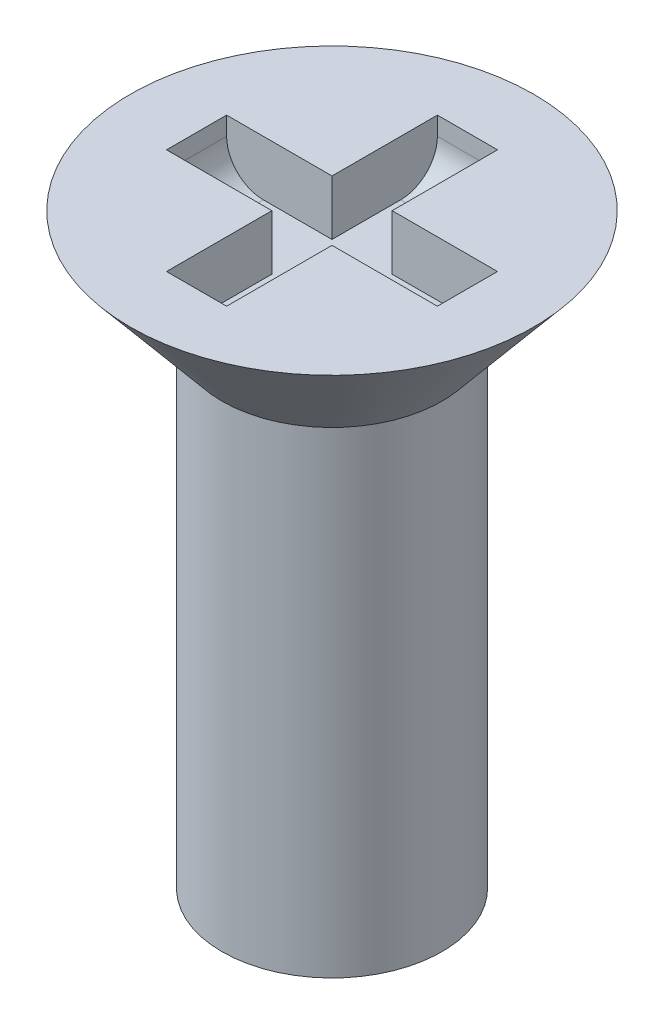
ISO-10303-21;
HEADER;
FILE_DESCRIPTION(('STEP AP214'),'2;1');
FILE_NAME('part.step','',(''),(''),'','','');
FILE_SCHEMA(('AUTOMOTIVE_DESIGN { 1 0 10303 214 1 1 1 1 }'));
ENDSEC;
DATA;
#1=APPLICATION_CONTEXT('core data for automotive mechanical design processes');
#2=APPLICATION_PROTOCOL_DEFINITION('international standard','automotive_design',2000,#1);
#3=PRODUCT_CONTEXT('',#1,'mechanical');
#4=PRODUCT('Part','Part','',(#3));
#5=PRODUCT_RELATED_PRODUCT_CATEGORY('part','',(#4));
#6=PRODUCT_DEFINITION_FORMATION('','',#4);
#7=PRODUCT_DEFINITION_CONTEXT('part definition',#1,'design');
#8=PRODUCT_DEFINITION('design','',#6,#7);
#9=PRODUCT_DEFINITION_SHAPE('','',#8);
#10=(LENGTH_UNIT() NAMED_UNIT(*) SI_UNIT(.MILLI.,.METRE.));
#11=(NAMED_UNIT(*) PLANE_ANGLE_UNIT() SI_UNIT($,.RADIAN.));
#12=(NAMED_UNIT(*) SI_UNIT($,.STERADIAN.) SOLID_ANGLE_UNIT());
#13=UNCERTAINTY_MEASURE_WITH_UNIT(LENGTH_MEASURE(1.E-05),#10,'distance_accuracy_value','');
#14=(GEOMETRIC_REPRESENTATION_CONTEXT(3) GLOBAL_UNCERTAINTY_ASSIGNED_CONTEXT((#13)) GLOBAL_UNIT_ASSIGNED_CONTEXT((#10,
#11,#12)) REPRESENTATION_CONTEXT('',''));
#15=CARTESIAN_POINT('',(0.,0.,0.));
#16=DIRECTION('',(0.,0.,1.));
#17=DIRECTION('',(1.,0.,0.));
#18=AXIS2_PLACEMENT_3D('',#15,#16,#17);
#19=CARTESIAN_POINT('',(-2.69311577807939,15.5,-0.81958016458445));
#20=DIRECTION('',(0.,0.,1.));
#21=DIRECTION('',(1.,0.,0.));
#22=AXIS2_PLACEMENT_3D('',#19,#20,#21);
#23=CYLINDRICAL_SURFACE('',#22,1.);
#24=DIRECTION('',(0.,0.,-1.));
#25=VECTOR('',#24,1.);
#26=CARTESIAN_POINT('',(-3.69311577807939,15.5,-0.819580164584451));
#27=LINE('',#26,#25);
#28=CARTESIAN_POINT('',(-3.69311577807939,15.5,0.819580164584451));
#29=VERTEX_POINT('',#28);
#30=CARTESIAN_POINT('',(-3.69311577807939,15.5,-0.819580164584451));
#31=VERTEX_POINT('',#30);
#32=EDGE_CURVE('E274',#29,#31,#27,.T.);
#33=ORIENTED_EDGE('',*,*,#32,.F.);
#34=CARTESIAN_POINT('',(-2.69311577807939,15.5,0.819580164584452));
#35=DIRECTION('',(0.,0.,1.));
#36=DIRECTION('',(1.,0.,0.));
#37=AXIS2_PLACEMENT_3D('',#34,#35,#36);
#38=CIRCLE('',#37,1.);
#39=CARTESIAN_POINT('',(-2.69311577807939,14.5,0.819580164584451));
#40=VERTEX_POINT('',#39);
#41=EDGE_CURVE('E40',#40,#29,#38,.F.);
#42=ORIENTED_EDGE('',*,*,#41,.F.);
#43=DIRECTION('',(0.,0.,-1.));
#44=VECTOR('',#43,1.);
#45=CARTESIAN_POINT('',(-2.69311577807939,14.5,-0.81958016458445));
#46=LINE('',#45,#44);
#47=CARTESIAN_POINT('',(-2.69311577807939,14.5,-0.819580164584451));
#48=VERTEX_POINT('',#47);
#49=EDGE_CURVE('E277',#48,#40,#46,.F.);
#50=ORIENTED_EDGE('',*,*,#49,.F.);
#51=CARTESIAN_POINT('',(-2.69311577807939,15.5,-0.819580164584451));
#52=DIRECTION('',(0.,0.,-1.));
#53=DIRECTION('',(-1.,0.,0.));
#54=AXIS2_PLACEMENT_3D('',#51,#52,#53);
#55=CIRCLE('',#54,1.);
#56=EDGE_CURVE('E11',#31,#48,#55,.F.);
#57=ORIENTED_EDGE('',*,*,#56,.F.);
#58=EDGE_LOOP('',(#33,#42,#50,#57));
#59=FACE_BOUND('',#58,.T.);
#60=ADVANCED_FACE('F33',(#59),#23,.F.);
#61=CARTESIAN_POINT('',(0.819580164584451,15.5,2.69311577807939));
#62=DIRECTION('',(1.,0.,0.));
#63=DIRECTION('',(0.,0.,-1.));
#64=AXIS2_PLACEMENT_3D('',#61,#62,#63);
#65=CYLINDRICAL_SURFACE('',#64,1.);
#66=DIRECTION('',(-1.,0.,0.));
#67=VECTOR('',#66,1.);
#68=CARTESIAN_POINT('',(0.819580164584451,15.5,3.69311577807939));
#69=LINE('',#68,#67);
#70=CARTESIAN_POINT('',(0.819580164584451,15.5,3.69311577807939));
#71=VERTEX_POINT('',#70);
#72=CARTESIAN_POINT('',(-0.819580164584451,15.5,3.69311577807939));
#73=VERTEX_POINT('',#72);
#74=EDGE_CURVE('E266',#71,#73,#69,.T.);
#75=ORIENTED_EDGE('',*,*,#74,.F.);
#76=CARTESIAN_POINT('',(0.819580164584451,15.5,2.69311577807939));
#77=DIRECTION('',(1.,0.,0.));
#78=DIRECTION('',(0.,0.,-1.));
#79=AXIS2_PLACEMENT_3D('',#76,#77,#78);
#80=CIRCLE('',#79,1.);
#81=CARTESIAN_POINT('',(0.819580164584451,14.5,2.69311577807939));
#82=VERTEX_POINT('',#81);
#83=EDGE_CURVE('E270',#82,#71,#80,.F.);
#84=ORIENTED_EDGE('',*,*,#83,.F.);
#85=DIRECTION('',(-1.,0.,0.));
#86=VECTOR('',#85,1.);
#87=CARTESIAN_POINT('',(0.819580164584451,14.5,2.69311577807939));
#88=LINE('',#87,#86);
#89=CARTESIAN_POINT('',(-0.819580164584451,14.5,2.69311577807939));
#90=VERTEX_POINT('',#89);
#91=EDGE_CURVE('E153',#90,#82,#88,.F.);
#92=ORIENTED_EDGE('',*,*,#91,.F.);
#93=CARTESIAN_POINT('',(-0.819580164584451,15.5,2.69311577807939));
#94=DIRECTION('',(-1.,0.,0.));
#95=DIRECTION('',(0.,0.,1.));
#96=AXIS2_PLACEMENT_3D('',#93,#94,#95);
#97=CIRCLE('',#96,1.);
#98=EDGE_CURVE('E272',#73,#90,#97,.F.);
#99=ORIENTED_EDGE('',*,*,#98,.F.);
#100=EDGE_LOOP('',(#75,#84,#92,#99));
#101=FACE_BOUND('',#100,.T.);
#102=ADVANCED_FACE('F338',(#101),#65,.F.);
#103=CARTESIAN_POINT('',(2.69311577807939,15.5,-0.819580164584451));
#104=DIRECTION('',(0.,0.,-1.));
#105=DIRECTION('',(-1.,0.,0.));
#106=AXIS2_PLACEMENT_3D('',#103,#104,#105);
#107=CYLINDRICAL_SURFACE('',#106,1.);
#108=DIRECTION('',(0.,0.,1.));
#109=VECTOR('',#108,1.);
#110=CARTESIAN_POINT('',(3.69311577807939,15.5,-0.819580164584452));
#111=LINE('',#110,#109);
#112=CARTESIAN_POINT('',(3.69311577807939,15.5,-0.819580164584452));
#113=VERTEX_POINT('',#112);
#114=CARTESIAN_POINT('',(3.69311577807939,15.5,0.81958016458445));
#115=VERTEX_POINT('',#114);
#116=EDGE_CURVE('E258',#113,#115,#111,.T.);
#117=ORIENTED_EDGE('',*,*,#116,.F.);
#118=CARTESIAN_POINT('',(2.69311577807939,15.5,-0.819580164584451));
#119=DIRECTION('',(0.,0.,-1.));
#120=DIRECTION('',(-1.,0.,0.));
#121=AXIS2_PLACEMENT_3D('',#118,#119,#120);
#122=CIRCLE('',#121,1.);
#123=CARTESIAN_POINT('',(2.69311577807939,14.5,-0.819580164584451));
#124=VERTEX_POINT('',#123);
#125=EDGE_CURVE('E263',#124,#113,#122,.F.);
#126=ORIENTED_EDGE('',*,*,#125,.F.);
#127=DIRECTION('',(0.,0.,1.));
#128=VECTOR('',#127,1.);
#129=CARTESIAN_POINT('',(2.69311577807939,14.5,-0.819580164584451));
#130=LINE('',#129,#128);
#131=CARTESIAN_POINT('',(2.69311577807939,14.5,0.819580164584451));
#132=VERTEX_POINT('',#131);
#133=EDGE_CURVE('E261',#132,#124,#130,.F.);
#134=ORIENTED_EDGE('',*,*,#133,.F.);
#135=CARTESIAN_POINT('',(2.69311577807939,15.5,0.81958016458445));
#136=DIRECTION('',(0.,0.,1.));
#137=DIRECTION('',(1.,0.,0.));
#138=AXIS2_PLACEMENT_3D('',#135,#136,#137);
#139=CIRCLE('',#138,1.);
#140=EDGE_CURVE('E170',#115,#132,#139,.F.);
#141=ORIENTED_EDGE('',*,*,#140,.F.);
#142=EDGE_LOOP('',(#117,#126,#134,#141));
#143=FACE_BOUND('',#142,.T.);
#144=ADVANCED_FACE('F324',(#143),#107,.F.);
#145=CARTESIAN_POINT('',(0.81958016458445,15.5,-2.69311577807939));
#146=DIRECTION('',(-1.,0.,0.));
#147=DIRECTION('',(0.,0.,1.));
#148=AXIS2_PLACEMENT_3D('',#145,#146,#147);
#149=CYLINDRICAL_SURFACE('',#148,1.);
#150=DIRECTION('',(1.,0.,0.));
#151=VECTOR('',#150,1.);
#152=CARTESIAN_POINT('',(0.81958016458445,15.5,-3.69311577807939));
#153=LINE('',#152,#151);
#154=CARTESIAN_POINT('',(-0.819580164584452,15.5,-3.69311577807939));
#155=VERTEX_POINT('',#154);
#156=CARTESIAN_POINT('',(0.81958016458445,15.5,-3.69311577807939));
#157=VERTEX_POINT('',#156);
#158=EDGE_CURVE('E246',#155,#157,#153,.T.);
#159=ORIENTED_EDGE('',*,*,#158,.F.);
#160=CARTESIAN_POINT('',(-0.819580164584451,15.5,-2.69311577807939));
#161=DIRECTION('',(-1.,0.,0.));
#162=DIRECTION('',(0.,0.,1.));
#163=AXIS2_PLACEMENT_3D('',#160,#161,#162);
#164=CIRCLE('',#163,1.);
#165=CARTESIAN_POINT('',(-0.819580164584451,14.5,-2.69311577807939));
#166=VERTEX_POINT('',#165);
#167=EDGE_CURVE('E254',#166,#155,#164,.F.);
#168=ORIENTED_EDGE('',*,*,#167,.F.);
#169=DIRECTION('',(1.,0.,0.));
#170=VECTOR('',#169,1.);
#171=CARTESIAN_POINT('',(0.81958016458445,14.5,-2.69311577807939));
#172=LINE('',#171,#170);
#173=CARTESIAN_POINT('',(0.819580164584451,14.5,-2.69311577807939));
#174=VERTEX_POINT('',#173);
#175=EDGE_CURVE('E251',#174,#166,#172,.F.);
#176=ORIENTED_EDGE('',*,*,#175,.F.);
#177=CARTESIAN_POINT('',(0.819580164584451,15.5,-2.69311577807939));
#178=DIRECTION('',(1.,0.,0.));
#179=DIRECTION('',(0.,0.,-1.));
#180=AXIS2_PLACEMENT_3D('',#177,#178,#179);
#181=CIRCLE('',#180,1.);
#182=EDGE_CURVE('E256',#157,#174,#181,.F.);
#183=ORIENTED_EDGE('',*,*,#182,.F.);
#184=EDGE_LOOP('',(#159,#168,#176,#183));
#185=FACE_BOUND('',#184,.T.);
#186=ADVANCED_FACE('F327',(#185),#149,.F.);
#187=CARTESIAN_POINT('',(0.,13.,0.));
#188=DIRECTION('',(0.,-1.,0.));
#189=DIRECTION('',(0.,0.,-1.));
#190=AXIS2_PLACEMENT_3D('',#187,#188,#189);
#191=CYLINDRICAL_SURFACE('',#190,3.);
#192=CARTESIAN_POINT('',(0.,13.,0.));
#193=DIRECTION('',(0.,1.,0.));
#194=DIRECTION('',(0.,0.,1.));
#195=AXIS2_PLACEMENT_3D('',#192,#193,#194);
#196=CIRCLE('',#195,3.);
#197=CARTESIAN_POINT('',(0.,13.,-3.));
#198=VERTEX_POINT('',#197);
#199=EDGE_CURVE('E243',#198,#198,#196,.T.);
#200=CARTESIAN_POINT('',(0.,0.,0.));
#201=DIRECTION('',(0.,1.,0.));
#202=DIRECTION('',(0.,0.,1.));
#203=AXIS2_PLACEMENT_3D('',#200,#201,#202);
#204=CIRCLE('',#203,3.);
#205=CARTESIAN_POINT('',(0.,0.,-3.));
#206=VERTEX_POINT('',#205);
#207=EDGE_CURVE('E242',#206,#206,#204,.T.);
#208=CARTESIAN_POINT('',(0.,13.,-3.));
#209=CARTESIAN_POINT('',(0.,12.8645833333333,-3.));
#210=CARTESIAN_POINT('',(0.,12.7291666666667,-3.));
#211=CARTESIAN_POINT('',(0.,12.4583333333333,-3.));
#212=CARTESIAN_POINT('',(0.,12.3229166666667,-3.));
#213=CARTESIAN_POINT('',(0.,12.0520833333333,-3.));
#214=CARTESIAN_POINT('',(0.,11.9166666666667,-3.));
#215=CARTESIAN_POINT('',(0.,11.6458333333333,-3.));
#216=CARTESIAN_POINT('',(0.,11.5104166666667,-3.));
#217=CARTESIAN_POINT('',(0.,11.2395833333333,-3.));
#218=CARTESIAN_POINT('',(0.,11.1041666666667,-3.));
#219=CARTESIAN_POINT('',(0.,10.8333333333333,-3.));
#220=CARTESIAN_POINT('',(0.,10.6979166666667,-3.));
#221=CARTESIAN_POINT('',(0.,10.4270833333333,-3.));
#222=CARTESIAN_POINT('',(0.,10.2916666666667,-3.));
#223=CARTESIAN_POINT('',(0.,10.0208333333333,-3.));
#224=CARTESIAN_POINT('',(0.,9.88541666666667,-3.));
#225=CARTESIAN_POINT('',(0.,9.61458333333333,-3.));
#226=CARTESIAN_POINT('',(0.,9.47916666666667,-3.));
#227=CARTESIAN_POINT('',(0.,9.20833333333333,-3.));
#228=CARTESIAN_POINT('',(0.,9.07291666666667,-3.));
#229=CARTESIAN_POINT('',(0.,8.80208333333333,-3.));
#230=CARTESIAN_POINT('',(0.,8.66666666666667,-3.));
#231=CARTESIAN_POINT('',(0.,8.39583333333333,-3.));
#232=CARTESIAN_POINT('',(0.,8.26041666666667,-3.));
#233=CARTESIAN_POINT('',(0.,7.98958333333333,-3.));
#234=CARTESIAN_POINT('',(0.,7.85416666666667,-3.));
#235=CARTESIAN_POINT('',(0.,7.58333333333333,-3.));
#236=CARTESIAN_POINT('',(0.,7.44791666666667,-3.));
#237=CARTESIAN_POINT('',(0.,7.17708333333333,-3.));
#238=CARTESIAN_POINT('',(0.,7.04166666666667,-3.));
#239=CARTESIAN_POINT('',(0.,6.77083333333333,-3.));
#240=CARTESIAN_POINT('',(0.,6.63541666666667,-3.));
#241=CARTESIAN_POINT('',(0.,6.36458333333333,-3.));
#242=CARTESIAN_POINT('',(0.,6.22916666666667,-3.));
#243=CARTESIAN_POINT('',(0.,5.95833333333333,-3.));
#244=CARTESIAN_POINT('',(0.,5.82291666666667,-3.));
#245=CARTESIAN_POINT('',(0.,5.55208333333333,-3.));
#246=CARTESIAN_POINT('',(0.,5.41666666666667,-3.));
#247=CARTESIAN_POINT('',(0.,5.14583333333333,-3.));
#248=CARTESIAN_POINT('',(0.,5.01041666666667,-3.));
#249=CARTESIAN_POINT('',(0.,4.73958333333333,-3.));
#250=CARTESIAN_POINT('',(0.,4.60416666666667,-3.));
#251=CARTESIAN_POINT('',(0.,4.33333333333333,-3.));
#252=CARTESIAN_POINT('',(0.,4.19791666666667,-3.));
#253=CARTESIAN_POINT('',(0.,3.92708333333333,-3.));
#254=CARTESIAN_POINT('',(0.,3.79166666666667,-3.));
#255=CARTESIAN_POINT('',(0.,3.52083333333333,-3.));
#256=CARTESIAN_POINT('',(0.,3.38541666666667,-3.));
#257=CARTESIAN_POINT('',(0.,3.11458333333333,-3.));
#258=CARTESIAN_POINT('',(0.,2.97916666666667,-3.));
#259=CARTESIAN_POINT('',(0.,2.70833333333333,-3.));
#260=CARTESIAN_POINT('',(0.,2.57291666666667,-3.));
#261=CARTESIAN_POINT('',(0.,2.30208333333333,-3.));
#262=CARTESIAN_POINT('',(0.,2.16666666666667,-3.));
#263=CARTESIAN_POINT('',(0.,1.89583333333333,-3.));
#264=CARTESIAN_POINT('',(0.,1.76041666666667,-3.));
#265=CARTESIAN_POINT('',(0.,1.48958333333333,-3.));
#266=CARTESIAN_POINT('',(0.,1.35416666666667,-3.));
#267=CARTESIAN_POINT('',(0.,1.08333333333333,-3.));
#268=CARTESIAN_POINT('',(0.,0.947916666666667,-3.));
#269=CARTESIAN_POINT('',(0.,0.677083333333334,-3.));
#270=CARTESIAN_POINT('',(0.,0.541666666666667,-3.));
#271=CARTESIAN_POINT('',(0.,0.270833333333334,-3.));
#272=CARTESIAN_POINT('',(0.,0.135416666666667,-3.));
#273=CARTESIAN_POINT('',(0.,0.,-3.));
#274=B_SPLINE_CURVE_WITH_KNOTS('',3,(#208,#209,#210,#211,#212,#213,#214,#215,#216,#217,#218,
#219,#220,#221,#222,#223,#224,#225,#226,#227,#228,#229,#230,#231,#232,#233,#234,#235,#236,#237,
#238,#239,#240,#241,#242,#243,#244,#245,#246,#247,#248,#249,#250,#251,#252,#253,#254,#255,#256,
#257,#258,#259,#260,#261,#262,#263,#264,#265,#266,#267,#268,#269,#270,#271,#272,#273),
.UNSPECIFIED.,.F.,.F.,(4,2,2,2,2,2,2,2,2,2,2,2,2,2,2,2,2,2,2,2,2,2,2,2,2,2,2,2,2,2,2,2,4),(0.,
0.406249999999999,0.812499999999999,1.21875,1.625,2.03125,2.4375,2.84375,3.25,3.65625,4.0625,
4.46875,4.875,5.28125,5.6875,6.09375,6.5,6.90625,7.3125,7.71875,8.125,8.53125,8.9375,9.34375,
9.75,10.15625,10.5625,10.96875,11.375,11.78125,12.1875,12.59375,13.),.UNSPECIFIED.);
#275=EDGE_CURVE('BSEAM329',#198,#206,#274,.T.);
#276=ORIENTED_EDGE('',*,*,#199,.F.);
#277=ORIENTED_EDGE('',*,*,#207,.T.);
#278=ORIENTED_EDGE('',*,*,#275,.T.);
#279=ORIENTED_EDGE('',*,*,#275,.F.);
#280=EDGE_LOOP('',(#276,#278,#277,#279));
#281=FACE_BOUND('',#280,.T.);
#282=ADVANCED_FACE('F329',(#281),#191,.T.);
#283=CARTESIAN_POINT('',(0.,0.,0.));
#284=DIRECTION('',(0.,1.,0.));
#285=DIRECTION('',(0.,0.,1.));
#286=AXIS2_PLACEMENT_3D('',#283,#284,#285);
#287=PLANE('',#286);
#288=ORIENTED_EDGE('',*,*,#207,.F.);
#289=EDGE_LOOP('',(#288));
#290=FACE_BOUND('',#289,.T.);
#291=ADVANCED_FACE('F335',(#290),#287,.F.);
#292=CARTESIAN_POINT('',(0.,16.,0.));
#293=DIRECTION('',(0.,1.,0.));
#294=DIRECTION('',(0.,0.,1.));
#295=AXIS2_PLACEMENT_3D('',#292,#293,#294);
#296=CONICAL_SURFACE('',#295,5.5,0.694738276196703);
#297=ORIENTED_EDGE('',*,*,#199,.T.);
#298=EDGE_LOOP('',(#297));
#299=FACE_BOUND('',#298,.T.);
#300=CARTESIAN_POINT('',(0.,16.,0.));
#301=DIRECTION('',(0.,-1.,0.));
#302=DIRECTION('',(0.,0.,-1.));
#303=AXIS2_PLACEMENT_3D('',#300,#301,#302);
#304=CIRCLE('',#303,5.5);
#305=CARTESIAN_POINT('',(0.,16.,-5.5));
#306=VERTEX_POINT('',#305);
#307=EDGE_CURVE('E222',#306,#306,#304,.T.);
#308=ORIENTED_EDGE('',*,*,#307,.T.);
#309=EDGE_LOOP('',(#308));
#310=FACE_BOUND('',#309,.T.);
#311=ADVANCED_FACE('F365',(#299,#310),#296,.T.);
#312=CARTESIAN_POINT('',(-5.5,16.,0.));
#313=DIRECTION('',(0.,-1.,0.));
#314=DIRECTION('',(0.,0.,-1.));
#315=AXIS2_PLACEMENT_3D('',#312,#313,#314);
#316=PLANE('',#315);
#317=DIRECTION('',(1.,0.,0.));
#318=VECTOR('',#317,1.);
#319=CARTESIAN_POINT('',(0.819580164584451,16.,3.69311577807939));
#320=LINE('',#319,#318);
#321=CARTESIAN_POINT('',(-0.819580164584451,16.,3.69311577807939));
#322=VERTEX_POINT('',#321);
#323=CARTESIAN_POINT('',(0.819580164584451,16.,3.69311577807939));
#324=VERTEX_POINT('',#323);
#325=EDGE_CURVE('E190',#322,#324,#320,.T.);
#326=ORIENTED_EDGE('',*,*,#325,.F.);
#327=DIRECTION('',(0.,0.,1.));
#328=VECTOR('',#327,1.);
#329=CARTESIAN_POINT('',(-0.819580164584451,16.,0.819580164584452));
#330=LINE('',#329,#328);
#331=CARTESIAN_POINT('',(-0.819580164584451,16.,0.819580164584452));
#332=VERTEX_POINT('',#331);
#333=EDGE_CURVE('E187',#332,#322,#330,.T.);
#334=ORIENTED_EDGE('',*,*,#333,.F.);
#335=DIRECTION('',(1.,0.,0.));
#336=VECTOR('',#335,1.);
#337=CARTESIAN_POINT('',(-0.819580164584451,16.,0.819580164584452));
#338=LINE('',#337,#336);
#339=CARTESIAN_POINT('',(-3.69311577807939,16.,0.819580164584451));
#340=VERTEX_POINT('',#339);
#341=EDGE_CURVE('E217',#340,#332,#338,.T.);
#342=ORIENTED_EDGE('',*,*,#341,.F.);
#343=DIRECTION('',(0.,0.,1.));
#344=VECTOR('',#343,1.);
#345=CARTESIAN_POINT('',(-3.69311577807939,16.,-0.819580164584451));
#346=LINE('',#345,#344);
#347=CARTESIAN_POINT('',(-3.69311577807939,16.,-0.819580164584451));
#348=VERTEX_POINT('',#347);
#349=EDGE_CURVE('E214',#348,#340,#346,.T.);
#350=ORIENTED_EDGE('',*,*,#349,.F.);
#351=DIRECTION('',(-1.,0.,0.));
#352=VECTOR('',#351,1.);
#353=CARTESIAN_POINT('',(-0.819580164584451,16.,-0.819580164584451));
#354=LINE('',#353,#352);
#355=CARTESIAN_POINT('',(-0.819580164584451,16.,-0.819580164584451));
#356=VERTEX_POINT('',#355);
#357=EDGE_CURVE('E211',#356,#348,#354,.T.);
#358=ORIENTED_EDGE('',*,*,#357,.F.);
#359=DIRECTION('',(0.,0.,1.));
#360=VECTOR('',#359,1.);
#361=CARTESIAN_POINT('',(-0.819580164584452,16.,-3.69311577807939));
#362=LINE('',#361,#360);
#363=CARTESIAN_POINT('',(-0.819580164584452,16.,-3.69311577807939));
#364=VERTEX_POINT('',#363);
#365=EDGE_CURVE('E208',#364,#356,#362,.T.);
#366=ORIENTED_EDGE('',*,*,#365,.F.);
#367=DIRECTION('',(-1.,0.,0.));
#368=VECTOR('',#367,1.);
#369=CARTESIAN_POINT('',(0.81958016458445,16.,-3.69311577807939));
#370=LINE('',#369,#368);
#371=CARTESIAN_POINT('',(0.81958016458445,16.,-3.69311577807939));
#372=VERTEX_POINT('',#371);
#373=EDGE_CURVE('E205',#372,#364,#370,.T.);
#374=ORIENTED_EDGE('',*,*,#373,.F.);
#375=DIRECTION('',(0.,0.,-1.));
#376=VECTOR('',#375,1.);
#377=CARTESIAN_POINT('',(0.81958016458445,16.,-3.69311577807939));
#378=LINE('',#377,#376);
#379=CARTESIAN_POINT('',(0.819580164584451,16.,-0.819580164584451));
#380=VERTEX_POINT('',#379);
#381=EDGE_CURVE('E202',#380,#372,#378,.T.);
#382=ORIENTED_EDGE('',*,*,#381,.F.);
#383=DIRECTION('',(-1.,0.,0.));
#384=VECTOR('',#383,1.);
#385=CARTESIAN_POINT('',(3.69311577807939,16.,-0.819580164584452));
#386=LINE('',#385,#384);
#387=CARTESIAN_POINT('',(3.69311577807939,16.,-0.819580164584452));
#388=VERTEX_POINT('',#387);
#389=EDGE_CURVE('E199',#388,#380,#386,.T.);
#390=ORIENTED_EDGE('',*,*,#389,.F.);
#391=DIRECTION('',(0.,0.,-1.));
#392=VECTOR('',#391,1.);
#393=CARTESIAN_POINT('',(3.69311577807939,16.,-0.819580164584452));
#394=LINE('',#393,#392);
#395=CARTESIAN_POINT('',(3.69311577807939,16.,0.81958016458445));
#396=VERTEX_POINT('',#395);
#397=EDGE_CURVE('E196',#396,#388,#394,.T.);
#398=ORIENTED_EDGE('',*,*,#397,.F.);
#399=DIRECTION('',(1.,0.,0.));
#400=VECTOR('',#399,1.);
#401=CARTESIAN_POINT('',(3.69311577807939,16.,0.81958016458445));
#402=LINE('',#401,#400);
#403=CARTESIAN_POINT('',(0.819580164584451,16.,0.819580164584451));
#404=VERTEX_POINT('',#403);
#405=EDGE_CURVE('E194',#404,#396,#402,.T.);
#406=ORIENTED_EDGE('',*,*,#405,.F.);
#407=DIRECTION('',(0.,0.,-1.));
#408=VECTOR('',#407,1.);
#409=CARTESIAN_POINT('',(0.819580164584451,16.,0.819580164584451));
#410=LINE('',#409,#408);
#411=EDGE_CURVE('E161',#324,#404,#410,.T.);
#412=ORIENTED_EDGE('',*,*,#411,.F.);
#413=EDGE_LOOP('',(#326,#334,#342,#350,#358,#366,#374,#382,#390,#398,#406,#412));
#414=FACE_BOUND('',#413,.T.);
#415=ORIENTED_EDGE('',*,*,#307,.F.);
#416=EDGE_LOOP('',(#415));
#417=FACE_BOUND('',#416,.T.);
#418=ADVANCED_FACE('F291',(#414,#417),#316,.F.);
#419=CARTESIAN_POINT('',(-0.819580164584451,14.5,0.819580164584452));
#420=DIRECTION('',(-1.,0.,0.));
#421=DIRECTION('',(0.,0.,1.));
#422=AXIS2_PLACEMENT_3D('',#419,#420,#421);
#423=PLANE('',#422);
#424=DIRECTION('',(0.,1.,0.));
#425=VECTOR('',#424,1.);
#426=CARTESIAN_POINT('',(-0.819580164584451,14.5,3.69311577807939));
#427=LINE('',#426,#425);
#428=EDGE_CURVE('E186',#73,#322,#427,.T.);
#429=ORIENTED_EDGE('',*,*,#428,.F.);
#430=ORIENTED_EDGE('',*,*,#98,.T.);
#431=DIRECTION('',(0.,0.,1.));
#432=VECTOR('',#431,1.);
#433=CARTESIAN_POINT('',(-0.819580164584451,14.5,0.819580164584452));
#434=LINE('',#433,#432);
#435=CARTESIAN_POINT('',(-0.819580164584451,14.5,0.819580164584452));
#436=VERTEX_POINT('',#435);
#437=EDGE_CURVE('E155',#436,#90,#434,.T.);
#438=ORIENTED_EDGE('',*,*,#437,.F.);
#439=DIRECTION('',(0.,1.,0.));
#440=VECTOR('',#439,1.);
#441=CARTESIAN_POINT('',(-0.819580164584451,14.5,0.819580164584452));
#442=LINE('',#441,#440);
#443=EDGE_CURVE('E220',#436,#332,#442,.T.);
#444=ORIENTED_EDGE('',*,*,#443,.T.);
#445=ORIENTED_EDGE('',*,*,#333,.T.);
#446=EDGE_LOOP('',(#429,#430,#438,#444,#445));
#447=FACE_BOUND('',#446,.T.);
#448=ADVANCED_FACE('F296',(#447),#423,.F.);
#449=CARTESIAN_POINT('',(-0.819580164584451,14.5,0.819580164584452));
#450=DIRECTION('',(0.,0.,1.));
#451=DIRECTION('',(1.,0.,0.));
#452=AXIS2_PLACEMENT_3D('',#449,#450,#451);
#453=PLANE('',#452);
#454=DIRECTION('',(1.,0.,0.));
#455=VECTOR('',#454,1.);
#456=CARTESIAN_POINT('',(-0.819580164584451,14.5,0.819580164584452));
#457=LINE('',#456,#455);
#458=EDGE_CURVE('E184',#40,#436,#457,.T.);
#459=ORIENTED_EDGE('',*,*,#458,.F.);
#460=ORIENTED_EDGE('',*,*,#41,.T.);
#461=DIRECTION('',(0.,1.,0.));
#462=VECTOR('',#461,1.);
#463=CARTESIAN_POINT('',(-3.69311577807939,14.5,0.819580164584451));
#464=LINE('',#463,#462);
#465=EDGE_CURVE('E223',#29,#340,#464,.T.);
#466=ORIENTED_EDGE('',*,*,#465,.T.);
#467=ORIENTED_EDGE('',*,*,#341,.T.);
#468=ORIENTED_EDGE('',*,*,#443,.F.);
#469=EDGE_LOOP('',(#459,#460,#466,#467,#468));
#470=FACE_BOUND('',#469,.T.);
#471=ADVANCED_FACE('F280',(#470),#453,.F.);
#472=CARTESIAN_POINT('',(-3.69311577807939,14.5,-0.819580164584451));
#473=DIRECTION('',(-1.,0.,0.));
#474=DIRECTION('',(0.,0.,1.));
#475=AXIS2_PLACEMENT_3D('',#472,#473,#474);
#476=PLANE('',#475);
#477=ORIENTED_EDGE('',*,*,#465,.F.);
#478=ORIENTED_EDGE('',*,*,#32,.T.);
#479=DIRECTION('',(0.,1.,0.));
#480=VECTOR('',#479,1.);
#481=CARTESIAN_POINT('',(-3.69311577807939,14.5,-0.819580164584451));
#482=LINE('',#481,#480);
#483=EDGE_CURVE('E225',#31,#348,#482,.T.);
#484=ORIENTED_EDGE('',*,*,#483,.T.);
#485=ORIENTED_EDGE('',*,*,#349,.T.);
#486=EDGE_LOOP('',(#477,#478,#484,#485));
#487=FACE_BOUND('',#486,.T.);
#488=ADVANCED_FACE('F284',(#487),#476,.F.);
#489=CARTESIAN_POINT('',(-0.819580164584451,14.5,-0.819580164584451));
#490=DIRECTION('',(0.,0.,-1.));
#491=DIRECTION('',(-1.,0.,0.));
#492=AXIS2_PLACEMENT_3D('',#489,#490,#491);
#493=PLANE('',#492);
#494=ORIENTED_EDGE('',*,*,#483,.F.);
#495=ORIENTED_EDGE('',*,*,#56,.T.);
#496=DIRECTION('',(-1.,0.,0.));
#497=VECTOR('',#496,1.);
#498=CARTESIAN_POINT('',(-0.819580164584451,14.5,-0.819580164584451));
#499=LINE('',#498,#497);
#500=CARTESIAN_POINT('',(-0.819580164584451,14.5,-0.819580164584451));
#501=VERTEX_POINT('',#500);
#502=EDGE_CURVE('E182',#501,#48,#499,.T.);
#503=ORIENTED_EDGE('',*,*,#502,.F.);
#504=DIRECTION('',(0.,1.,0.));
#505=VECTOR('',#504,1.);
#506=CARTESIAN_POINT('',(-0.819580164584451,14.5,-0.819580164584451));
#507=LINE('',#506,#505);
#508=EDGE_CURVE('E227',#501,#356,#507,.T.);
#509=ORIENTED_EDGE('',*,*,#508,.T.);
#510=ORIENTED_EDGE('',*,*,#357,.T.);
#511=EDGE_LOOP('',(#494,#495,#503,#509,#510));
#512=FACE_BOUND('',#511,.T.);
#513=ADVANCED_FACE('F299',(#512),#493,.F.);
#514=CARTESIAN_POINT('',(-0.819580164584452,14.5,-3.69311577807939));
#515=DIRECTION('',(-1.,0.,0.));
#516=DIRECTION('',(0.,0.,1.));
#517=AXIS2_PLACEMENT_3D('',#514,#515,#516);
#518=PLANE('',#517);
#519=DIRECTION('',(0.,0.,1.));
#520=VECTOR('',#519,1.);
#521=CARTESIAN_POINT('',(-0.819580164584452,14.5,-3.69311577807939));
#522=LINE('',#521,#520);
#523=EDGE_CURVE('E180',#166,#501,#522,.T.);
#524=ORIENTED_EDGE('',*,*,#523,.F.);
#525=ORIENTED_EDGE('',*,*,#167,.T.);
#526=DIRECTION('',(0.,1.,0.));
#527=VECTOR('',#526,1.);
#528=CARTESIAN_POINT('',(-0.819580164584452,14.5,-3.69311577807939));
#529=LINE('',#528,#527);
#530=EDGE_CURVE('E229',#155,#364,#529,.T.);
#531=ORIENTED_EDGE('',*,*,#530,.T.);
#532=ORIENTED_EDGE('',*,*,#365,.T.);
#533=ORIENTED_EDGE('',*,*,#508,.F.);
#534=EDGE_LOOP('',(#524,#525,#531,#532,#533));
#535=FACE_BOUND('',#534,.T.);
#536=ADVANCED_FACE('F302',(#535),#518,.F.);
#537=CARTESIAN_POINT('',(0.81958016458445,14.5,-3.69311577807939));
#538=DIRECTION('',(0.,0.,-1.));
#539=DIRECTION('',(-1.,0.,0.));
#540=AXIS2_PLACEMENT_3D('',#537,#538,#539);
#541=PLANE('',#540);
#542=ORIENTED_EDGE('',*,*,#530,.F.);
#543=ORIENTED_EDGE('',*,*,#158,.T.);
#544=DIRECTION('',(0.,1.,0.));
#545=VECTOR('',#544,1.);
#546=CARTESIAN_POINT('',(0.81958016458445,14.5,-3.69311577807939));
#547=LINE('',#546,#545);
#548=EDGE_CURVE('E231',#157,#372,#547,.T.);
#549=ORIENTED_EDGE('',*,*,#548,.T.);
#550=ORIENTED_EDGE('',*,*,#373,.T.);
#551=EDGE_LOOP('',(#542,#543,#549,#550));
#552=FACE_BOUND('',#551,.T.);
#553=ADVANCED_FACE('F308',(#552),#541,.F.);
#554=CARTESIAN_POINT('',(0.81958016458445,14.5,-3.69311577807939));
#555=DIRECTION('',(1.,0.,0.));
#556=DIRECTION('',(0.,0.,-1.));
#557=AXIS2_PLACEMENT_3D('',#554,#555,#556);
#558=PLANE('',#557);
#559=ORIENTED_EDGE('',*,*,#548,.F.);
#560=ORIENTED_EDGE('',*,*,#182,.T.);
#561=DIRECTION('',(0.,0.,-1.));
#562=VECTOR('',#561,1.);
#563=CARTESIAN_POINT('',(0.81958016458445,14.5,-3.69311577807939));
#564=LINE('',#563,#562);
#565=CARTESIAN_POINT('',(0.819580164584451,14.5,-0.819580164584451));
#566=VERTEX_POINT('',#565);
#567=EDGE_CURVE('E174',#566,#174,#564,.T.);
#568=ORIENTED_EDGE('',*,*,#567,.F.);
#569=DIRECTION('',(0.,1.,0.));
#570=VECTOR('',#569,1.);
#571=CARTESIAN_POINT('',(0.819580164584451,14.5,-0.819580164584451));
#572=LINE('',#571,#570);
#573=EDGE_CURVE('E233',#566,#380,#572,.T.);
#574=ORIENTED_EDGE('',*,*,#573,.T.);
#575=ORIENTED_EDGE('',*,*,#381,.T.);
#576=EDGE_LOOP('',(#559,#560,#568,#574,#575));
#577=FACE_BOUND('',#576,.T.);
#578=ADVANCED_FACE('F312',(#577),#558,.F.);
#579=CARTESIAN_POINT('',(3.69311577807939,14.5,-0.819580164584452));
#580=DIRECTION('',(0.,0.,-1.));
#581=DIRECTION('',(-1.,0.,0.));
#582=AXIS2_PLACEMENT_3D('',#579,#580,#581);
#583=PLANE('',#582);
#584=DIRECTION('',(-1.,0.,0.));
#585=VECTOR('',#584,1.);
#586=CARTESIAN_POINT('',(3.69311577807939,14.5,-0.819580164584452));
#587=LINE('',#586,#585);
#588=EDGE_CURVE('E172',#124,#566,#587,.T.);
#589=ORIENTED_EDGE('',*,*,#588,.F.);
#590=ORIENTED_EDGE('',*,*,#125,.T.);
#591=DIRECTION('',(0.,1.,0.));
#592=VECTOR('',#591,1.);
#593=CARTESIAN_POINT('',(3.69311577807939,14.5,-0.819580164584452));
#594=LINE('',#593,#592);
#595=EDGE_CURVE('E235',#113,#388,#594,.T.);
#596=ORIENTED_EDGE('',*,*,#595,.T.);
#597=ORIENTED_EDGE('',*,*,#389,.T.);
#598=ORIENTED_EDGE('',*,*,#573,.F.);
#599=EDGE_LOOP('',(#589,#590,#596,#597,#598));
#600=FACE_BOUND('',#599,.T.);
#601=ADVANCED_FACE('F317',(#600),#583,.F.);
#602=CARTESIAN_POINT('',(3.69311577807939,14.5,-0.819580164584452));
#603=DIRECTION('',(1.,0.,0.));
#604=DIRECTION('',(0.,0.,-1.));
#605=AXIS2_PLACEMENT_3D('',#602,#603,#604);
#606=PLANE('',#605);
#607=ORIENTED_EDGE('',*,*,#595,.F.);
#608=ORIENTED_EDGE('',*,*,#116,.T.);
#609=DIRECTION('',(0.,1.,0.));
#610=VECTOR('',#609,1.);
#611=CARTESIAN_POINT('',(3.69311577807939,14.5,0.81958016458445));
#612=LINE('',#611,#610);
#613=EDGE_CURVE('E165',#115,#396,#612,.T.);
#614=ORIENTED_EDGE('',*,*,#613,.T.);
#615=ORIENTED_EDGE('',*,*,#397,.T.);
#616=EDGE_LOOP('',(#607,#608,#614,#615));
#617=FACE_BOUND('',#616,.T.);
#618=ADVANCED_FACE('F321',(#617),#606,.F.);
#619=CARTESIAN_POINT('',(3.69311577807939,14.5,0.81958016458445));
#620=DIRECTION('',(0.,0.,1.));
#621=DIRECTION('',(1.,0.,0.));
#622=AXIS2_PLACEMENT_3D('',#619,#620,#621);
#623=PLANE('',#622);
#624=ORIENTED_EDGE('',*,*,#613,.F.);
#625=ORIENTED_EDGE('',*,*,#140,.T.);
#626=DIRECTION('',(1.,0.,0.));
#627=VECTOR('',#626,1.);
#628=CARTESIAN_POINT('',(3.69311577807939,14.5,0.81958016458445));
#629=LINE('',#628,#627);
#630=CARTESIAN_POINT('',(0.819580164584451,14.5,0.819580164584451));
#631=VERTEX_POINT('',#630);
#632=EDGE_CURVE('E150',#631,#132,#629,.T.);
#633=ORIENTED_EDGE('',*,*,#632,.F.);
#634=DIRECTION('',(0.,1.,0.));
#635=VECTOR('',#634,1.);
#636=CARTESIAN_POINT('',(0.819580164584451,14.5,0.819580164584451));
#637=LINE('',#636,#635);
#638=EDGE_CURVE('E158',#631,#404,#637,.T.);
#639=ORIENTED_EDGE('',*,*,#638,.T.);
#640=ORIENTED_EDGE('',*,*,#405,.T.);
#641=EDGE_LOOP('',(#624,#625,#633,#639,#640));
#642=FACE_BOUND('',#641,.T.);
#643=ADVANCED_FACE('F169',(#642),#623,.F.);
#644=CARTESIAN_POINT('',(0.819580164584451,14.5,0.819580164584451));
#645=DIRECTION('',(1.,0.,0.));
#646=DIRECTION('',(0.,0.,-1.));
#647=AXIS2_PLACEMENT_3D('',#644,#645,#646);
#648=PLANE('',#647);
#649=DIRECTION('',(0.,0.,-1.));
#650=VECTOR('',#649,1.);
#651=CARTESIAN_POINT('',(0.819580164584451,14.5,0.819580164584451));
#652=LINE('',#651,#650);
#653=EDGE_CURVE('E144',#82,#631,#652,.T.);
#654=ORIENTED_EDGE('',*,*,#653,.F.);
#655=ORIENTED_EDGE('',*,*,#83,.T.);
#656=DIRECTION('',(0.,1.,0.));
#657=VECTOR('',#656,1.);
#658=CARTESIAN_POINT('',(0.819580164584451,14.5,3.69311577807939));
#659=LINE('',#658,#657);
#660=EDGE_CURVE('E166',#71,#324,#659,.T.);
#661=ORIENTED_EDGE('',*,*,#660,.T.);
#662=ORIENTED_EDGE('',*,*,#411,.T.);
#663=ORIENTED_EDGE('',*,*,#638,.F.);
#664=EDGE_LOOP('',(#654,#655,#661,#662,#663));
#665=FACE_BOUND('',#664,.T.);
#666=ADVANCED_FACE('F159',(#665),#648,.F.);
#667=CARTESIAN_POINT('',(0.819580164584451,14.5,3.69311577807939));
#668=DIRECTION('',(0.,0.,1.));
#669=DIRECTION('',(1.,0.,0.));
#670=AXIS2_PLACEMENT_3D('',#667,#668,#669);
#671=PLANE('',#670);
#672=ORIENTED_EDGE('',*,*,#660,.F.);
#673=ORIENTED_EDGE('',*,*,#74,.T.);
#674=ORIENTED_EDGE('',*,*,#428,.T.);
#675=ORIENTED_EDGE('',*,*,#325,.T.);
#676=EDGE_LOOP('',(#672,#673,#674,#675));
#677=FACE_BOUND('',#676,.T.);
#678=ADVANCED_FACE('F350',(#677),#671,.F.);
#679=CARTESIAN_POINT('',(0.,14.5,0.));
#680=DIRECTION('',(0.,-1.,0.));
#681=DIRECTION('',(0.,0.,-1.));
#682=AXIS2_PLACEMENT_3D('',#679,#680,#681);
#683=PLANE('',#682);
#684=ORIENTED_EDGE('',*,*,#502,.T.);
#685=ORIENTED_EDGE('',*,*,#49,.T.);
#686=ORIENTED_EDGE('',*,*,#458,.T.);
#687=ORIENTED_EDGE('',*,*,#437,.T.);
#688=ORIENTED_EDGE('',*,*,#91,.T.);
#689=ORIENTED_EDGE('',*,*,#653,.T.);
#690=ORIENTED_EDGE('',*,*,#632,.T.);
#691=ORIENTED_EDGE('',*,*,#133,.T.);
#692=ORIENTED_EDGE('',*,*,#588,.T.);
#693=ORIENTED_EDGE('',*,*,#567,.T.);
#694=ORIENTED_EDGE('',*,*,#175,.T.);
#695=ORIENTED_EDGE('',*,*,#523,.T.);
#696=EDGE_LOOP('',(#684,#685,#686,#687,#688,#689,#690,#691,#692,#693,#694,#695));
#697=FACE_BOUND('',#696,.T.);
#698=ADVANCED_FACE('F147',(#697),#683,.F.);
#699=CLOSED_SHELL('',(#60,#102,#144,#186,#282,#291,#311,#418,#448,#471,#488,#513,#536,#553,#578,
#601,#618,#643,#666,#678,#698));
#700=MANIFOLD_SOLID_BREP('B2',#699);
#701=ADVANCED_BREP_SHAPE_REPRESENTATION('',(#18,#700),#14);
#702=SHAPE_DEFINITION_REPRESENTATION(#9,#701);
ENDSEC;
END-ISO-10303-21;
